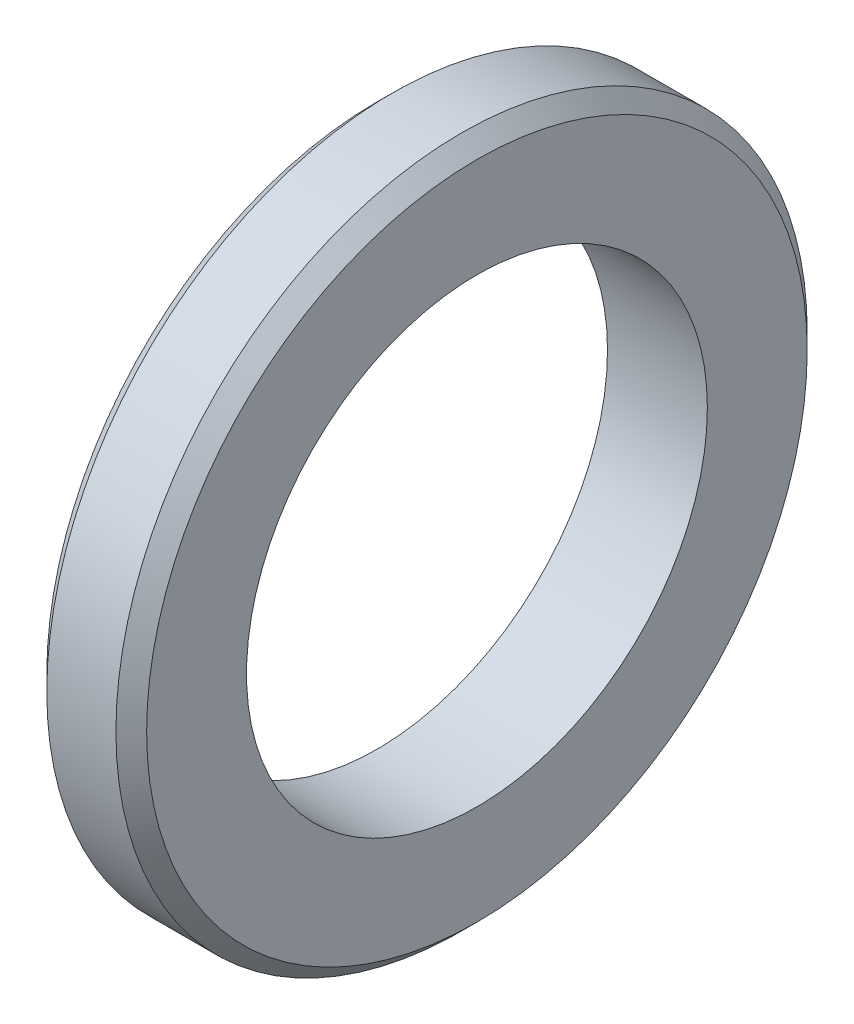
ISO-10303-21;
HEADER;
FILE_DESCRIPTION(('STEP AP214'),'2;1');
FILE_NAME('part.step','',(''),(''),'','','');
FILE_SCHEMA(('AUTOMOTIVE_DESIGN { 1 0 10303 214 1 1 1 1 }'));
ENDSEC;
DATA;
#1=APPLICATION_CONTEXT('core data for automotive mechanical design processes');
#2=APPLICATION_PROTOCOL_DEFINITION('international standard','automotive_design',2000,#1);
#3=PRODUCT_CONTEXT('',#1,'mechanical');
#4=PRODUCT('Part','Part','',(#3));
#5=PRODUCT_RELATED_PRODUCT_CATEGORY('part','',(#4));
#6=PRODUCT_DEFINITION_FORMATION('','',#4);
#7=PRODUCT_DEFINITION_CONTEXT('part definition',#1,'design');
#8=PRODUCT_DEFINITION('design','',#6,#7);
#9=PRODUCT_DEFINITION_SHAPE('','',#8);
#10=(LENGTH_UNIT() NAMED_UNIT(*) SI_UNIT(.MILLI.,.METRE.));
#11=(NAMED_UNIT(*) PLANE_ANGLE_UNIT() SI_UNIT($,.RADIAN.));
#12=(NAMED_UNIT(*) SI_UNIT($,.STERADIAN.) SOLID_ANGLE_UNIT());
#13=UNCERTAINTY_MEASURE_WITH_UNIT(LENGTH_MEASURE(1.E-05),#10,'distance_accuracy_value','');
#14=(GEOMETRIC_REPRESENTATION_CONTEXT(3) GLOBAL_UNCERTAINTY_ASSIGNED_CONTEXT((#13)) GLOBAL_UNIT_ASSIGNED_CONTEXT((#10,
#11,#12)) REPRESENTATION_CONTEXT('',''));
#15=CARTESIAN_POINT('',(0.,0.,0.));
#16=DIRECTION('',(0.,0.,1.));
#17=DIRECTION('',(1.,0.,0.));
#18=AXIS2_PLACEMENT_3D('',#15,#16,#17);
#19=CARTESIAN_POINT('',(0.200000000006639,0.,0.));
#20=DIRECTION('',(1.,0.,0.));
#21=DIRECTION('',(0.,0.,-1.));
#22=AXIS2_PLACEMENT_3D('',#19,#20,#21);
#23=CONICAL_SURFACE('',#22,4.50000000000728,0.785398163539557);
#24=CARTESIAN_POINT('',(0.,0.,0.));
#25=DIRECTION('',(1.,0.,0.));
#26=DIRECTION('',(0.,0.,-1.));
#27=AXIS2_PLACEMENT_3D('',#24,#25,#26);
#28=CIRCLE('',#27,4.29999999994379);
#29=CARTESIAN_POINT('',(0.,0.,-4.29999999994379));
#30=VERTEX_POINT('',#29);
#31=EDGE_CURVE('E17',#30,#30,#28,.F.);
#32=ORIENTED_EDGE('',*,*,#31,.F.);
#33=EDGE_LOOP('',(#32));
#34=FACE_BOUND('',#33,.T.);
#35=CARTESIAN_POINT('',(0.2,0.,0.));
#36=DIRECTION('',(1.,0.,0.));
#37=DIRECTION('',(0.,0.,-1.));
#38=AXIS2_PLACEMENT_3D('',#35,#36,#37);
#39=CIRCLE('',#38,4.5);
#40=CARTESIAN_POINT('',(0.2,0.,-4.5));
#41=VERTEX_POINT('',#40);
#42=EDGE_CURVE('E29',#41,#41,#39,.T.);
#43=ORIENTED_EDGE('',*,*,#42,.F.);
#44=EDGE_LOOP('',(#43));
#45=FACE_BOUND('',#44,.T.);
#46=ADVANCED_FACE('F14',(#34,#45),#23,.T.);
#47=CARTESIAN_POINT('',(0.65,0.,0.));
#48=DIRECTION('',(1.,0.,0.));
#49=DIRECTION('',(0.,0.,-1.));
#50=AXIS2_PLACEMENT_3D('',#47,#48,#49);
#51=CYLINDRICAL_SURFACE('',#50,4.5);
#52=ORIENTED_EDGE('',*,*,#42,.T.);
#53=EDGE_LOOP('',(#52));
#54=FACE_BOUND('',#53,.T.);
#55=CARTESIAN_POINT('',(1.09999999995125,0.,0.));
#56=DIRECTION('',(-1.,0.,0.));
#57=DIRECTION('',(0.,1.,0.));
#58=AXIS2_PLACEMENT_3D('',#55,#56,#57);
#59=CIRCLE('',#58,4.50000000000728);
#60=CARTESIAN_POINT('',(1.09999999995125,4.50000000000728,0.));
#61=VERTEX_POINT('',#60);
#62=EDGE_CURVE('E32',#61,#61,#59,.F.);
#63=ORIENTED_EDGE('',*,*,#62,.F.);
#64=EDGE_LOOP('',(#63));
#65=FACE_BOUND('',#64,.T.);
#66=ADVANCED_FACE('F44',(#54,#65),#51,.T.);
#67=CARTESIAN_POINT('',(0.,3.65,0.));
#68=DIRECTION('',(-1.,0.,0.));
#69=DIRECTION('',(0.,0.,1.));
#70=AXIS2_PLACEMENT_3D('',#67,#68,#69);
#71=PLANE('',#70);
#72=ORIENTED_EDGE('',*,*,#31,.T.);
#73=EDGE_LOOP('',(#72));
#74=FACE_BOUND('',#73,.T.);
#75=CARTESIAN_POINT('',(0.,0.,0.));
#76=DIRECTION('',(1.,0.,0.));
#77=DIRECTION('',(0.,0.,-1.));
#78=AXIS2_PLACEMENT_3D('',#75,#76,#77);
#79=CIRCLE('',#78,3.);
#80=CARTESIAN_POINT('',(0.,0.,-3.));
#81=VERTEX_POINT('',#80);
#82=EDGE_CURVE('E26',#81,#81,#79,.T.);
#83=ORIENTED_EDGE('',*,*,#82,.T.);
#84=EDGE_LOOP('',(#83));
#85=FACE_BOUND('',#84,.T.);
#86=ADVANCED_FACE('F53',(#74,#85),#71,.T.);
#87=CARTESIAN_POINT('',(1.09999999995125,0.,0.));
#88=DIRECTION('',(-1.,0.,0.));
#89=DIRECTION('',(0.,0.,1.));
#90=AXIS2_PLACEMENT_3D('',#87,#88,#89);
#91=CONICAL_SURFACE('',#90,4.50000000000728,0.785398163539557);
#92=ORIENTED_EDGE('',*,*,#62,.T.);
#93=EDGE_LOOP('',(#92));
#94=FACE_BOUND('',#93,.T.);
#95=CARTESIAN_POINT('',(1.29999999995789,0.,0.));
#96=DIRECTION('',(-1.,0.,0.));
#97=DIRECTION('',(0.,0.,1.));
#98=AXIS2_PLACEMENT_3D('',#95,#96,#97);
#99=CIRCLE('',#98,4.29999999994379);
#100=CARTESIAN_POINT('',(1.29999999995789,0.,4.29999999994379));
#101=VERTEX_POINT('',#100);
#102=EDGE_CURVE('E21',#101,#101,#99,.F.);
#103=ORIENTED_EDGE('',*,*,#102,.F.);
#104=EDGE_LOOP('',(#103));
#105=FACE_BOUND('',#104,.T.);
#106=ADVANCED_FACE('F61',(#94,#105),#91,.T.);
#107=CARTESIAN_POINT('',(0.65,0.,0.));
#108=DIRECTION('',(1.,0.,0.));
#109=DIRECTION('',(0.,0.,-1.));
#110=AXIS2_PLACEMENT_3D('',#107,#108,#109);
#111=CYLINDRICAL_SURFACE('',#110,3.);
#112=CARTESIAN_POINT('',(1.3,0.,0.));
#113=DIRECTION('',(1.,0.,0.));
#114=DIRECTION('',(0.,0.,-1.));
#115=AXIS2_PLACEMENT_3D('',#112,#113,#114);
#116=CIRCLE('',#115,3.);
#117=CARTESIAN_POINT('',(1.3,0.,-3.));
#118=VERTEX_POINT('',#117);
#119=EDGE_CURVE('E10',#118,#118,#116,.F.);
#120=ORIENTED_EDGE('',*,*,#119,.F.);
#121=EDGE_LOOP('',(#120));
#122=FACE_BOUND('',#121,.T.);
#123=ORIENTED_EDGE('',*,*,#82,.F.);
#124=EDGE_LOOP('',(#123));
#125=FACE_BOUND('',#124,.T.);
#126=ADVANCED_FACE('F56',(#122,#125),#111,.F.);
#127=CARTESIAN_POINT('',(1.3,3.65,0.));
#128=DIRECTION('',(1.,0.,0.));
#129=DIRECTION('',(0.,0.,-1.));
#130=AXIS2_PLACEMENT_3D('',#127,#128,#129);
#131=PLANE('',#130);
#132=ORIENTED_EDGE('',*,*,#119,.T.);
#133=EDGE_LOOP('',(#132));
#134=FACE_BOUND('',#133,.T.);
#135=ORIENTED_EDGE('',*,*,#102,.T.);
#136=EDGE_LOOP('',(#135));
#137=FACE_BOUND('',#136,.T.);
#138=ADVANCED_FACE('F54',(#134,#137),#131,.T.);
#139=CLOSED_SHELL('',(#46,#66,#86,#106,#126,#138));
#140=MANIFOLD_SOLID_BREP('B1',#139);
#141=ADVANCED_BREP_SHAPE_REPRESENTATION('',(#18,#140),#14);
#142=SHAPE_DEFINITION_REPRESENTATION(#9,#141);
ENDSEC;
END-ISO-10303-21;
